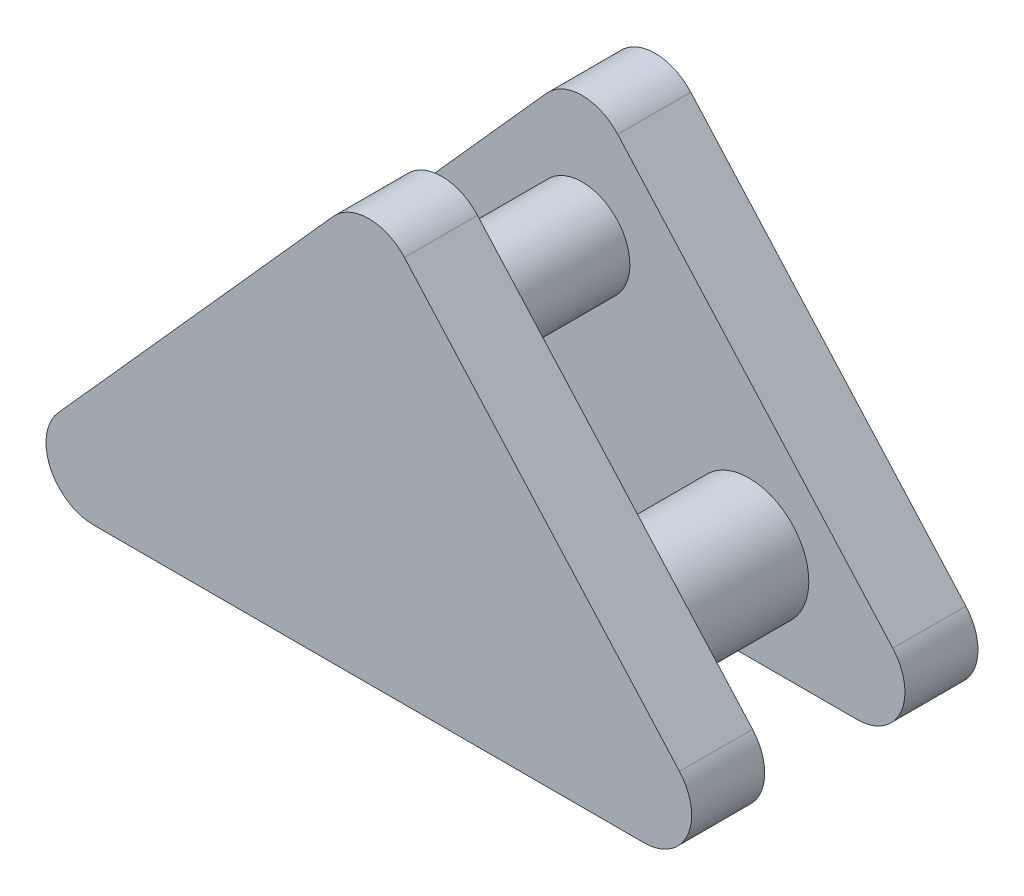
ISO-10303-21;
HEADER;
FILE_DESCRIPTION(('STEP AP214'),'2;1');
FILE_NAME('part.step','',(''),(''),'','','');
FILE_SCHEMA(('AUTOMOTIVE_DESIGN { 1 0 10303 214 1 1 1 1 }'));
ENDSEC;
DATA;
#1=APPLICATION_CONTEXT('core data for automotive mechanical design processes');
#2=APPLICATION_PROTOCOL_DEFINITION('international standard','automotive_design',2000,#1);
#3=PRODUCT_CONTEXT('',#1,'mechanical');
#4=PRODUCT('Part','Part','',(#3));
#5=PRODUCT_RELATED_PRODUCT_CATEGORY('part','',(#4));
#6=PRODUCT_DEFINITION_FORMATION('','',#4);
#7=PRODUCT_DEFINITION_CONTEXT('part definition',#1,'design');
#8=PRODUCT_DEFINITION('design','',#6,#7);
#9=PRODUCT_DEFINITION_SHAPE('','',#8);
#10=(LENGTH_UNIT() NAMED_UNIT(*) SI_UNIT(.MILLI.,.METRE.));
#11=(NAMED_UNIT(*) PLANE_ANGLE_UNIT() SI_UNIT($,.RADIAN.));
#12=(NAMED_UNIT(*) SI_UNIT($,.STERADIAN.) SOLID_ANGLE_UNIT());
#13=UNCERTAINTY_MEASURE_WITH_UNIT(LENGTH_MEASURE(1.E-05),#10,'distance_accuracy_value','');
#14=(GEOMETRIC_REPRESENTATION_CONTEXT(3) GLOBAL_UNCERTAINTY_ASSIGNED_CONTEXT((#13)) GLOBAL_UNIT_ASSIGNED_CONTEXT((#10,
#11,#12)) REPRESENTATION_CONTEXT('',''));
#15=CARTESIAN_POINT('',(0.,0.,0.));
#16=DIRECTION('',(0.,0.,1.));
#17=DIRECTION('',(1.,0.,0.));
#18=AXIS2_PLACEMENT_3D('',#15,#16,#17);
#19=CARTESIAN_POINT('',(0.,5.87463905713637,6.));
#20=DIRECTION('',(0.,0.,-1.));
#21=DIRECTION('',(-1.,0.,0.));
#22=AXIS2_PLACEMENT_3D('',#19,#20,#21);
#23=CYLINDRICAL_SURFACE('',#22,1.);
#24=CARTESIAN_POINT('',(0.,5.87463905713637,4.46937750553797));
#25=DIRECTION('',(0.,0.,1.));
#26=DIRECTION('',(1.,0.,0.));
#27=AXIS2_PLACEMENT_3D('',#24,#25,#26);
#28=CIRCLE('',#27,1.);
#29=CARTESIAN_POINT('',(1.,5.87463905713637,4.46937750553797));
#30=VERTEX_POINT('',#29);
#31=EDGE_CURVE('E163',#30,#30,#28,.F.);
#32=ORIENTED_EDGE('',*,*,#31,.T.);
#33=EDGE_LOOP('',(#32));
#34=FACE_BOUND('',#33,.T.);
#35=CARTESIAN_POINT('',(0.,5.87463905713637,1.53062249446203));
#36=DIRECTION('',(0.,0.,-1.));
#37=DIRECTION('',(0.,1.,0.));
#38=AXIS2_PLACEMENT_3D('',#35,#36,#37);
#39=CIRCLE('',#38,1.);
#40=CARTESIAN_POINT('',(0.,6.87463905713637,1.53062249446203));
#41=VERTEX_POINT('',#40);
#42=EDGE_CURVE('E166',#41,#41,#39,.T.);
#43=ORIENTED_EDGE('',*,*,#42,.F.);
#44=EDGE_LOOP('',(#43));
#45=FACE_BOUND('',#44,.T.);
#46=ADVANCED_FACE('F37',(#34,#45),#23,.T.);
#47=CARTESIAN_POINT('',(0.,8.94427190999916,6.));
#48=DIRECTION('',(0.74535599249993,-0.666666666666667,0.));
#49=DIRECTION('',(0.666666666666667,0.74535599249993,0.));
#50=AXIS2_PLACEMENT_3D('',#47,#48,#49);
#51=PLANE('',#50);
#52=DIRECTION('',(-0.666666666666667,-0.74535599249993,0.));
#53=VECTOR('',#52,1.);
#54=CARTESIAN_POINT('',(0.,8.94427190999916,4.46937750553797));
#55=LINE('',#54,#53);
#56=CARTESIAN_POINT('',(-0.74535599249993,8.11093857666583,4.46937750553797));
#57=VERTEX_POINT('',#56);
#58=CARTESIAN_POINT('',(-6.50928801500014,1.66666666666667,4.46937750553797));
#59=VERTEX_POINT('',#58);
#60=EDGE_CURVE('E154',#57,#59,#55,.T.);
#61=ORIENTED_EDGE('',*,*,#60,.T.);
#62=DIRECTION('',(0.,0.,-1.));
#63=VECTOR('',#62,1.);
#64=CARTESIAN_POINT('',(-6.50928801500014,1.66666666666667,6.));
#65=LINE('',#64,#63);
#66=CARTESIAN_POINT('',(-6.50928801500014,1.66666666666667,6.));
#67=VERTEX_POINT('',#66);
#68=EDGE_CURVE('E132',#59,#67,#65,.F.);
#69=ORIENTED_EDGE('',*,*,#68,.T.);
#70=DIRECTION('',(-0.666666666666667,-0.74535599249993,0.));
#71=VECTOR('',#70,1.);
#72=CARTESIAN_POINT('',(0.,8.94427190999916,6.));
#73=LINE('',#72,#71);
#74=CARTESIAN_POINT('',(-0.74535599249993,8.11093857666583,6.));
#75=VERTEX_POINT('',#74);
#76=EDGE_CURVE('E157',#75,#67,#73,.T.);
#77=ORIENTED_EDGE('',*,*,#76,.F.);
#78=DIRECTION('',(0.,0.,-1.));
#79=VECTOR('',#78,1.);
#80=CARTESIAN_POINT('',(-0.74535599249993,8.11093857666583,6.));
#81=LINE('',#80,#79);
#82=EDGE_CURVE('E137',#75,#57,#81,.T.);
#83=ORIENTED_EDGE('',*,*,#82,.T.);
#84=EDGE_LOOP('',(#61,#69,#77,#83));
#85=FACE_BOUND('',#84,.T.);
#86=ADVANCED_FACE('F226',(#85),#51,.F.);
#87=CARTESIAN_POINT('',(-8.,0.,6.));
#88=DIRECTION('',(0.,1.,0.));
#89=DIRECTION('',(0.,0.,1.));
#90=AXIS2_PLACEMENT_3D('',#87,#88,#89);
#91=PLANE('',#90);
#92=DIRECTION('',(1.,0.,0.));
#93=VECTOR('',#92,1.);
#94=CARTESIAN_POINT('',(-8.,0.,6.));
#95=LINE('',#94,#93);
#96=CARTESIAN_POINT('',(-5.76393202250021,0.,6.));
#97=VERTEX_POINT('',#96);
#98=CARTESIAN_POINT('',(5.76393202250021,0.,6.));
#99=VERTEX_POINT('',#98);
#100=EDGE_CURVE('E147',#97,#99,#95,.T.);
#101=ORIENTED_EDGE('',*,*,#100,.F.);
#102=DIRECTION('',(0.,0.,-1.));
#103=VECTOR('',#102,1.);
#104=CARTESIAN_POINT('',(-5.76393202250021,0.,6.));
#105=LINE('',#104,#103);
#106=CARTESIAN_POINT('',(-5.76393202250021,0.,4.46937750553797));
#107=VERTEX_POINT('',#106);
#108=EDGE_CURVE('E131',#97,#107,#105,.T.);
#109=ORIENTED_EDGE('',*,*,#108,.T.);
#110=DIRECTION('',(1.,0.,0.));
#111=VECTOR('',#110,1.);
#112=CARTESIAN_POINT('',(-8.,0.,4.46937750553797));
#113=LINE('',#112,#111);
#114=CARTESIAN_POINT('',(5.76393202250021,0.,4.46937750553797));
#115=VERTEX_POINT('',#114);
#116=EDGE_CURVE('E144',#107,#115,#113,.T.);
#117=ORIENTED_EDGE('',*,*,#116,.T.);
#118=DIRECTION('',(0.,0.,-1.));
#119=VECTOR('',#118,1.);
#120=CARTESIAN_POINT('',(5.76393202250021,0.,6.));
#121=LINE('',#120,#119);
#122=EDGE_CURVE('E149',#115,#99,#121,.F.);
#123=ORIENTED_EDGE('',*,*,#122,.T.);
#124=EDGE_LOOP('',(#101,#109,#117,#123));
#125=FACE_BOUND('',#124,.T.);
#126=ADVANCED_FACE('F143',(#125),#91,.F.);
#127=CARTESIAN_POINT('',(8.,0.,6.));
#128=DIRECTION('',(-0.74535599249993,-0.666666666666667,0.));
#129=DIRECTION('',(0.666666666666667,-0.74535599249993,0.));
#130=AXIS2_PLACEMENT_3D('',#127,#128,#129);
#131=PLANE('',#130);
#132=DIRECTION('',(-0.666666666666667,0.74535599249993,0.));
#133=VECTOR('',#132,1.);
#134=CARTESIAN_POINT('',(8.,0.,4.46937750553797));
#135=LINE('',#134,#133);
#136=CARTESIAN_POINT('',(6.50928801500014,1.66666666666667,4.46937750553797));
#137=VERTEX_POINT('',#136);
#138=CARTESIAN_POINT('',(0.745355992499931,8.11093857666583,4.46937750553797));
#139=VERTEX_POINT('',#138);
#140=EDGE_CURVE('E153',#137,#139,#135,.T.);
#141=ORIENTED_EDGE('',*,*,#140,.T.);
#142=DIRECTION('',(0.,0.,-1.));
#143=VECTOR('',#142,1.);
#144=CARTESIAN_POINT('',(0.745355992499931,8.11093857666583,6.));
#145=LINE('',#144,#143);
#146=CARTESIAN_POINT('',(0.745355992499931,8.11093857666583,6.));
#147=VERTEX_POINT('',#146);
#148=EDGE_CURVE('E208',#139,#147,#145,.F.);
#149=ORIENTED_EDGE('',*,*,#148,.T.);
#150=DIRECTION('',(-0.666666666666667,0.74535599249993,0.));
#151=VECTOR('',#150,1.);
#152=CARTESIAN_POINT('',(8.,0.,6.));
#153=LINE('',#152,#151);
#154=CARTESIAN_POINT('',(6.50928801500014,1.66666666666667,6.));
#155=VERTEX_POINT('',#154);
#156=EDGE_CURVE('E167',#155,#147,#153,.T.);
#157=ORIENTED_EDGE('',*,*,#156,.F.);
#158=DIRECTION('',(0.,0.,-1.));
#159=VECTOR('',#158,1.);
#160=CARTESIAN_POINT('',(6.50928801500014,1.66666666666667,6.));
#161=LINE('',#160,#159);
#162=EDGE_CURVE('E205',#155,#137,#161,.T.);
#163=ORIENTED_EDGE('',*,*,#162,.T.);
#164=EDGE_LOOP('',(#141,#149,#157,#163));
#165=FACE_BOUND('',#164,.T.);
#166=ADVANCED_FACE('F213',(#165),#131,.F.);
#167=CARTESIAN_POINT('',(0.,0.,6.));
#168=DIRECTION('',(0.,0.,-1.));
#169=DIRECTION('',(-1.,0.,0.));
#170=AXIS2_PLACEMENT_3D('',#167,#168,#169);
#171=PLANE('',#170);
#172=ORIENTED_EDGE('',*,*,#76,.T.);
#173=CARTESIAN_POINT('',(-5.76393202250021,1.,6.));
#174=DIRECTION('',(0.,0.,-1.));
#175=DIRECTION('',(-1.,0.,0.));
#176=AXIS2_PLACEMENT_3D('',#173,#174,#175);
#177=CIRCLE('',#176,1.);
#178=EDGE_CURVE('E182',#67,#97,#177,.F.);
#179=ORIENTED_EDGE('',*,*,#178,.T.);
#180=ORIENTED_EDGE('',*,*,#100,.T.);
#181=CARTESIAN_POINT('',(5.76393202250021,1.,6.));
#182=DIRECTION('',(0.,0.,-1.));
#183=DIRECTION('',(-1.,0.,0.));
#184=AXIS2_PLACEMENT_3D('',#181,#182,#183);
#185=CIRCLE('',#184,1.);
#186=EDGE_CURVE('E178',#99,#155,#185,.F.);
#187=ORIENTED_EDGE('',*,*,#186,.T.);
#188=ORIENTED_EDGE('',*,*,#156,.T.);
#189=CARTESIAN_POINT('',(0.,7.44427190999916,6.));
#190=DIRECTION('',(0.,0.,-1.));
#191=DIRECTION('',(-1.,0.,0.));
#192=AXIS2_PLACEMENT_3D('',#189,#190,#191);
#193=CIRCLE('',#192,1.);
#194=EDGE_CURVE('E180',#147,#75,#193,.F.);
#195=ORIENTED_EDGE('',*,*,#194,.T.);
#196=EDGE_LOOP('',(#172,#179,#180,#187,#188,#195));
#197=FACE_BOUND('',#196,.T.);
#198=ADVANCED_FACE('F219',(#197),#171,.F.);
#199=CARTESIAN_POINT('',(-8.,0.,4.46937750553797));
#200=DIRECTION('',(0.,0.,1.));
#201=DIRECTION('',(1.,0.,0.));
#202=AXIS2_PLACEMENT_3D('',#199,#200,#201);
#203=PLANE('',#202);
#204=CARTESIAN_POINT('',(3.5,2.,4.46937750553797));
#205=DIRECTION('',(0.,0.,1.));
#206=DIRECTION('',(1.,0.,0.));
#207=AXIS2_PLACEMENT_3D('',#204,#205,#206);
#208=CIRCLE('',#207,1.25);
#209=CARTESIAN_POINT('',(4.75,2.,4.46937750553797));
#210=VERTEX_POINT('',#209);
#211=EDGE_CURVE('E171',#210,#210,#208,.F.);
#212=ORIENTED_EDGE('',*,*,#211,.F.);
#213=EDGE_LOOP('',(#212));
#214=FACE_BOUND('',#213,.T.);
#215=CARTESIAN_POINT('',(-3.5,2.,4.46937750553797));
#216=DIRECTION('',(0.,0.,1.));
#217=DIRECTION('',(1.,0.,0.));
#218=AXIS2_PLACEMENT_3D('',#215,#216,#217);
#219=CIRCLE('',#218,1.25);
#220=CARTESIAN_POINT('',(-2.25,2.,4.46937750553797));
#221=VERTEX_POINT('',#220);
#222=EDGE_CURVE('E243',#221,#221,#219,.F.);
#223=ORIENTED_EDGE('',*,*,#222,.F.);
#224=EDGE_LOOP('',(#223));
#225=FACE_BOUND('',#224,.T.);
#226=ORIENTED_EDGE('',*,*,#31,.F.);
#227=EDGE_LOOP('',(#226));
#228=FACE_BOUND('',#227,.T.);
#229=ORIENTED_EDGE('',*,*,#116,.F.);
#230=CARTESIAN_POINT('',(-5.76393202250021,1.,4.46937750553797));
#231=DIRECTION('',(0.,0.,1.));
#232=DIRECTION('',(1.,0.,0.));
#233=AXIS2_PLACEMENT_3D('',#230,#231,#232);
#234=CIRCLE('',#233,1.);
#235=EDGE_CURVE('E127',#107,#59,#234,.F.);
#236=ORIENTED_EDGE('',*,*,#235,.T.);
#237=ORIENTED_EDGE('',*,*,#60,.F.);
#238=CARTESIAN_POINT('',(0.,7.44427190999916,4.46937750553797));
#239=DIRECTION('',(0.,0.,1.));
#240=DIRECTION('',(1.,0.,0.));
#241=AXIS2_PLACEMENT_3D('',#238,#239,#240);
#242=CIRCLE('',#241,1.);
#243=EDGE_CURVE('E138',#57,#139,#242,.F.);
#244=ORIENTED_EDGE('',*,*,#243,.T.);
#245=ORIENTED_EDGE('',*,*,#140,.F.);
#246=CARTESIAN_POINT('',(5.76393202250021,1.,4.46937750553797));
#247=DIRECTION('',(0.,0.,1.));
#248=DIRECTION('',(1.,0.,0.));
#249=AXIS2_PLACEMENT_3D('',#246,#247,#248);
#250=CIRCLE('',#249,1.);
#251=EDGE_CURVE('E148',#137,#115,#250,.F.);
#252=ORIENTED_EDGE('',*,*,#251,.T.);
#253=EDGE_LOOP('',(#229,#236,#237,#244,#245,#252));
#254=FACE_BOUND('',#253,.T.);
#255=ADVANCED_FACE('F151',(#214,#225,#228,#254),#203,.F.);
#256=CARTESIAN_POINT('',(8.,0.,6.));
#257=DIRECTION('',(-0.74535599249993,-0.666666666666667,0.));
#258=DIRECTION('',(0.666666666666667,-0.74535599249993,0.));
#259=AXIS2_PLACEMENT_3D('',#256,#257,#258);
#260=PLANE('',#259);
#261=DIRECTION('',(0.666666666666667,-0.74535599249993,0.));
#262=VECTOR('',#261,1.);
#263=CARTESIAN_POINT('',(8.,0.,1.53062249446203));
#264=LINE('',#263,#262);
#265=CARTESIAN_POINT('',(0.745355992499931,8.11093857666583,1.53062249446203));
#266=VERTEX_POINT('',#265);
#267=CARTESIAN_POINT('',(6.50928801500014,1.66666666666667,1.53062249446203));
#268=VERTEX_POINT('',#267);
#269=EDGE_CURVE('E159',#266,#268,#264,.T.);
#270=ORIENTED_EDGE('',*,*,#269,.T.);
#271=DIRECTION('',(0.,0.,-1.));
#272=VECTOR('',#271,1.);
#273=CARTESIAN_POINT('',(6.50928801500014,1.66666666666667,6.));
#274=LINE('',#273,#272);
#275=CARTESIAN_POINT('',(6.50928801500014,1.66666666666667,0.));
#276=VERTEX_POINT('',#275);
#277=EDGE_CURVE('E11',#268,#276,#274,.T.);
#278=ORIENTED_EDGE('',*,*,#277,.T.);
#279=DIRECTION('',(-0.666666666666667,0.74535599249993,0.));
#280=VECTOR('',#279,1.);
#281=CARTESIAN_POINT('',(8.,0.,0.));
#282=LINE('',#281,#280);
#283=CARTESIAN_POINT('',(0.745355992499931,8.11093857666583,0.));
#284=VERTEX_POINT('',#283);
#285=EDGE_CURVE('E230',#276,#284,#282,.T.);
#286=ORIENTED_EDGE('',*,*,#285,.T.);
#287=DIRECTION('',(0.,0.,-1.));
#288=VECTOR('',#287,1.);
#289=CARTESIAN_POINT('',(0.745355992499931,8.11093857666583,6.));
#290=LINE('',#289,#288);
#291=EDGE_CURVE('E45',#284,#266,#290,.F.);
#292=ORIENTED_EDGE('',*,*,#291,.T.);
#293=EDGE_LOOP('',(#270,#278,#286,#292));
#294=FACE_BOUND('',#293,.T.);
#295=ADVANCED_FACE('F286',(#294),#260,.F.);
#296=CARTESIAN_POINT('',(-8.,0.,6.));
#297=DIRECTION('',(0.,1.,0.));
#298=DIRECTION('',(0.,0.,1.));
#299=AXIS2_PLACEMENT_3D('',#296,#297,#298);
#300=PLANE('',#299);
#301=DIRECTION('',(1.,0.,0.));
#302=VECTOR('',#301,1.);
#303=CARTESIAN_POINT('',(-8.,0.,1.53062249446203));
#304=LINE('',#303,#302);
#305=CARTESIAN_POINT('',(-5.76393202250021,0.,1.53062249446203));
#306=VERTEX_POINT('',#305);
#307=CARTESIAN_POINT('',(5.76393202250021,0.,1.53062249446203));
#308=VERTEX_POINT('',#307);
#309=EDGE_CURVE('E241',#306,#308,#304,.T.);
#310=ORIENTED_EDGE('',*,*,#309,.F.);
#311=DIRECTION('',(0.,0.,-1.));
#312=VECTOR('',#311,1.);
#313=CARTESIAN_POINT('',(-5.76393202250021,0.,6.));
#314=LINE('',#313,#312);
#315=CARTESIAN_POINT('',(-5.76393202250021,0.,0.));
#316=VERTEX_POINT('',#315);
#317=EDGE_CURVE('E186',#306,#316,#314,.T.);
#318=ORIENTED_EDGE('',*,*,#317,.T.);
#319=DIRECTION('',(1.,0.,0.));
#320=VECTOR('',#319,1.);
#321=CARTESIAN_POINT('',(-8.,0.,0.));
#322=LINE('',#321,#320);
#323=CARTESIAN_POINT('',(5.76393202250021,0.,0.));
#324=VERTEX_POINT('',#323);
#325=EDGE_CURVE('E232',#316,#324,#322,.T.);
#326=ORIENTED_EDGE('',*,*,#325,.T.);
#327=DIRECTION('',(0.,0.,-1.));
#328=VECTOR('',#327,1.);
#329=CARTESIAN_POINT('',(5.76393202250021,0.,6.));
#330=LINE('',#329,#328);
#331=EDGE_CURVE('E184',#324,#308,#330,.F.);
#332=ORIENTED_EDGE('',*,*,#331,.T.);
#333=EDGE_LOOP('',(#310,#318,#326,#332));
#334=FACE_BOUND('',#333,.T.);
#335=ADVANCED_FACE('F278',(#334),#300,.F.);
#336=CARTESIAN_POINT('',(0.,8.94427190999916,6.));
#337=DIRECTION('',(0.74535599249993,-0.666666666666667,0.));
#338=DIRECTION('',(0.666666666666667,0.74535599249993,0.));
#339=AXIS2_PLACEMENT_3D('',#336,#337,#338);
#340=PLANE('',#339);
#341=DIRECTION('',(-0.666666666666667,-0.74535599249993,0.));
#342=VECTOR('',#341,1.);
#343=CARTESIAN_POINT('',(0.,8.94427190999916,0.));
#344=LINE('',#343,#342);
#345=CARTESIAN_POINT('',(-0.74535599249993,8.11093857666583,0.));
#346=VERTEX_POINT('',#345);
#347=CARTESIAN_POINT('',(-6.50928801500014,1.66666666666667,0.));
#348=VERTEX_POINT('',#347);
#349=EDGE_CURVE('E235',#346,#348,#344,.T.);
#350=ORIENTED_EDGE('',*,*,#349,.T.);
#351=DIRECTION('',(0.,0.,-1.));
#352=VECTOR('',#351,1.);
#353=CARTESIAN_POINT('',(-6.50928801500014,1.66666666666667,6.));
#354=LINE('',#353,#352);
#355=CARTESIAN_POINT('',(-6.50928801500014,1.66666666666667,1.53062249446203));
#356=VERTEX_POINT('',#355);
#357=EDGE_CURVE('E198',#348,#356,#354,.F.);
#358=ORIENTED_EDGE('',*,*,#357,.T.);
#359=DIRECTION('',(0.666666666666667,0.74535599249993,0.));
#360=VECTOR('',#359,1.);
#361=CARTESIAN_POINT('',(0.,8.94427190999916,1.53062249446203));
#362=LINE('',#361,#360);
#363=CARTESIAN_POINT('',(-0.74535599249993,8.11093857666583,1.53062249446203));
#364=VERTEX_POINT('',#363);
#365=EDGE_CURVE('E238',#356,#364,#362,.T.);
#366=ORIENTED_EDGE('',*,*,#365,.T.);
#367=DIRECTION('',(0.,0.,-1.));
#368=VECTOR('',#367,1.);
#369=CARTESIAN_POINT('',(-0.74535599249993,8.11093857666583,6.));
#370=LINE('',#369,#368);
#371=EDGE_CURVE('E195',#364,#346,#370,.T.);
#372=ORIENTED_EDGE('',*,*,#371,.T.);
#373=EDGE_LOOP('',(#350,#358,#366,#372));
#374=FACE_BOUND('',#373,.T.);
#375=ADVANCED_FACE('F261',(#374),#340,.F.);
#376=CARTESIAN_POINT('',(-8.,8.94427190999916,1.53062249446203));
#377=DIRECTION('',(0.,0.,-1.));
#378=DIRECTION('',(0.,1.,0.));
#379=AXIS2_PLACEMENT_3D('',#376,#377,#378);
#380=PLANE('',#379);
#381=CARTESIAN_POINT('',(3.5,2.,1.53062249446203));
#382=DIRECTION('',(0.,0.,-1.));
#383=DIRECTION('',(0.,1.,0.));
#384=AXIS2_PLACEMENT_3D('',#381,#382,#383);
#385=CIRCLE('',#384,1.25);
#386=CARTESIAN_POINT('',(3.5,3.25,1.53062249446203));
#387=VERTEX_POINT('',#386);
#388=EDGE_CURVE('E246',#387,#387,#385,.F.);
#389=ORIENTED_EDGE('',*,*,#388,.F.);
#390=EDGE_LOOP('',(#389));
#391=FACE_BOUND('',#390,.T.);
#392=CARTESIAN_POINT('',(-3.5,2.,1.53062249446203));
#393=DIRECTION('',(0.,0.,-1.));
#394=DIRECTION('',(0.,1.,0.));
#395=AXIS2_PLACEMENT_3D('',#392,#393,#394);
#396=CIRCLE('',#395,1.25);
#397=CARTESIAN_POINT('',(-3.5,3.25,1.53062249446203));
#398=VERTEX_POINT('',#397);
#399=EDGE_CURVE('E170',#398,#398,#396,.F.);
#400=ORIENTED_EDGE('',*,*,#399,.F.);
#401=EDGE_LOOP('',(#400));
#402=FACE_BOUND('',#401,.T.);
#403=ORIENTED_EDGE('',*,*,#42,.T.);
#404=EDGE_LOOP('',(#403));
#405=FACE_BOUND('',#404,.T.);
#406=ORIENTED_EDGE('',*,*,#365,.F.);
#407=CARTESIAN_POINT('',(-5.76393202250021,1.,1.53062249446203));
#408=DIRECTION('',(0.,0.,-1.));
#409=DIRECTION('',(0.,1.,0.));
#410=AXIS2_PLACEMENT_3D('',#407,#408,#409);
#411=CIRCLE('',#410,1.);
#412=EDGE_CURVE('E203',#356,#306,#411,.F.);
#413=ORIENTED_EDGE('',*,*,#412,.T.);
#414=ORIENTED_EDGE('',*,*,#309,.T.);
#415=CARTESIAN_POINT('',(5.76393202250021,1.,1.53062249446203));
#416=DIRECTION('',(0.,0.,-1.));
#417=DIRECTION('',(0.,1.,0.));
#418=AXIS2_PLACEMENT_3D('',#415,#416,#417);
#419=CIRCLE('',#418,1.);
#420=EDGE_CURVE('E52',#308,#268,#419,.F.);
#421=ORIENTED_EDGE('',*,*,#420,.T.);
#422=ORIENTED_EDGE('',*,*,#269,.F.);
#423=CARTESIAN_POINT('',(0.,7.44427190999916,1.53062249446203));
#424=DIRECTION('',(0.,0.,-1.));
#425=DIRECTION('',(0.,1.,0.));
#426=AXIS2_PLACEMENT_3D('',#423,#424,#425);
#427=CIRCLE('',#426,1.);
#428=EDGE_CURVE('E200',#266,#364,#427,.F.);
#429=ORIENTED_EDGE('',*,*,#428,.T.);
#430=EDGE_LOOP('',(#406,#413,#414,#421,#422,#429));
#431=FACE_BOUND('',#430,.T.);
#432=ADVANCED_FACE('F257',(#391,#402,#405,#431),#380,.F.);
#433=CARTESIAN_POINT('',(0.,5.87463905713637,0.));
#434=DIRECTION('',(0.,0.,1.));
#435=DIRECTION('',(1.,0.,0.));
#436=AXIS2_PLACEMENT_3D('',#433,#434,#435);
#437=PLANE('',#436);
#438=ORIENTED_EDGE('',*,*,#325,.F.);
#439=CARTESIAN_POINT('',(-5.76393202250021,1.,0.));
#440=DIRECTION('',(0.,0.,1.));
#441=DIRECTION('',(1.,0.,0.));
#442=AXIS2_PLACEMENT_3D('',#439,#440,#441);
#443=CIRCLE('',#442,1.);
#444=EDGE_CURVE('E193',#316,#348,#443,.F.);
#445=ORIENTED_EDGE('',*,*,#444,.T.);
#446=ORIENTED_EDGE('',*,*,#349,.F.);
#447=CARTESIAN_POINT('',(0.,7.44427190999916,0.));
#448=DIRECTION('',(0.,0.,1.));
#449=DIRECTION('',(1.,0.,0.));
#450=AXIS2_PLACEMENT_3D('',#447,#448,#449);
#451=CIRCLE('',#450,1.);
#452=EDGE_CURVE('E189',#346,#284,#451,.F.);
#453=ORIENTED_EDGE('',*,*,#452,.T.);
#454=ORIENTED_EDGE('',*,*,#285,.F.);
#455=CARTESIAN_POINT('',(5.76393202250021,1.,0.));
#456=DIRECTION('',(0.,0.,1.));
#457=DIRECTION('',(1.,0.,0.));
#458=AXIS2_PLACEMENT_3D('',#455,#456,#457);
#459=CIRCLE('',#458,1.);
#460=EDGE_CURVE('E191',#276,#324,#459,.F.);
#461=ORIENTED_EDGE('',*,*,#460,.T.);
#462=EDGE_LOOP('',(#438,#445,#446,#453,#454,#461));
#463=FACE_BOUND('',#462,.T.);
#464=ADVANCED_FACE('F260',(#463),#437,.F.);
#465=CARTESIAN_POINT('',(-3.5,2.,6.));
#466=DIRECTION('',(0.,0.,-1.));
#467=DIRECTION('',(-1.,0.,0.));
#468=AXIS2_PLACEMENT_3D('',#465,#466,#467);
#469=CYLINDRICAL_SURFACE('',#468,1.25);
#470=ORIENTED_EDGE('',*,*,#399,.T.);
#471=EDGE_LOOP('',(#470));
#472=FACE_BOUND('',#471,.T.);
#473=ORIENTED_EDGE('',*,*,#222,.T.);
#474=EDGE_LOOP('',(#473));
#475=FACE_BOUND('',#474,.T.);
#476=ADVANCED_FACE('F367',(#472,#475),#469,.T.);
#477=CARTESIAN_POINT('',(3.5,2.,6.));
#478=DIRECTION('',(0.,0.,-1.));
#479=DIRECTION('',(-1.,0.,0.));
#480=AXIS2_PLACEMENT_3D('',#477,#478,#479);
#481=CYLINDRICAL_SURFACE('',#480,1.25);
#482=ORIENTED_EDGE('',*,*,#388,.T.);
#483=EDGE_LOOP('',(#482));
#484=FACE_BOUND('',#483,.T.);
#485=ORIENTED_EDGE('',*,*,#211,.T.);
#486=EDGE_LOOP('',(#485));
#487=FACE_BOUND('',#486,.T.);
#488=ADVANCED_FACE('F254',(#484,#487),#481,.T.);
#489=CARTESIAN_POINT('',(-5.76393202250021,1.,6.));
#490=DIRECTION('',(0.,0.,-1.));
#491=DIRECTION('',(-1.,0.,0.));
#492=AXIS2_PLACEMENT_3D('',#489,#490,#491);
#493=CYLINDRICAL_SURFACE('',#492,1.);
#494=ORIENTED_EDGE('',*,*,#178,.F.);
#495=ORIENTED_EDGE('',*,*,#68,.F.);
#496=ORIENTED_EDGE('',*,*,#235,.F.);
#497=ORIENTED_EDGE('',*,*,#108,.F.);
#498=EDGE_LOOP('',(#494,#495,#496,#497));
#499=FACE_BOUND('',#498,.T.);
#500=ADVANCED_FACE('F130',(#499),#493,.T.);
#501=CARTESIAN_POINT('',(-5.76393202250021,1.,6.));
#502=DIRECTION('',(0.,0.,-1.));
#503=DIRECTION('',(-1.,0.,0.));
#504=AXIS2_PLACEMENT_3D('',#501,#502,#503);
#505=CYLINDRICAL_SURFACE('',#504,1.);
#506=ORIENTED_EDGE('',*,*,#412,.F.);
#507=ORIENTED_EDGE('',*,*,#357,.F.);
#508=ORIENTED_EDGE('',*,*,#444,.F.);
#509=ORIENTED_EDGE('',*,*,#317,.F.);
#510=EDGE_LOOP('',(#506,#507,#508,#509));
#511=FACE_BOUND('',#510,.T.);
#512=ADVANCED_FACE('F275',(#511),#505,.T.);
#513=CARTESIAN_POINT('',(0.,7.44427190999916,6.));
#514=DIRECTION('',(0.,0.,-1.));
#515=DIRECTION('',(-1.,0.,0.));
#516=AXIS2_PLACEMENT_3D('',#513,#514,#515);
#517=CYLINDRICAL_SURFACE('',#516,1.);
#518=ORIENTED_EDGE('',*,*,#194,.F.);
#519=ORIENTED_EDGE('',*,*,#148,.F.);
#520=ORIENTED_EDGE('',*,*,#243,.F.);
#521=ORIENTED_EDGE('',*,*,#82,.F.);
#522=EDGE_LOOP('',(#518,#519,#520,#521));
#523=FACE_BOUND('',#522,.T.);
#524=ADVANCED_FACE('F224',(#523),#517,.T.);
#525=CARTESIAN_POINT('',(5.76393202250021,1.,6.));
#526=DIRECTION('',(0.,0.,-1.));
#527=DIRECTION('',(-1.,0.,0.));
#528=AXIS2_PLACEMENT_3D('',#525,#526,#527);
#529=CYLINDRICAL_SURFACE('',#528,1.);
#530=ORIENTED_EDGE('',*,*,#186,.F.);
#531=ORIENTED_EDGE('',*,*,#122,.F.);
#532=ORIENTED_EDGE('',*,*,#251,.F.);
#533=ORIENTED_EDGE('',*,*,#162,.F.);
#534=EDGE_LOOP('',(#530,#531,#532,#533));
#535=FACE_BOUND('',#534,.T.);
#536=ADVANCED_FACE('F319',(#535),#529,.T.);
#537=CARTESIAN_POINT('',(5.76393202250021,1.,6.));
#538=DIRECTION('',(0.,0.,-1.));
#539=DIRECTION('',(-1.,0.,0.));
#540=AXIS2_PLACEMENT_3D('',#537,#538,#539);
#541=CYLINDRICAL_SURFACE('',#540,1.);
#542=ORIENTED_EDGE('',*,*,#420,.F.);
#543=ORIENTED_EDGE('',*,*,#331,.F.);
#544=ORIENTED_EDGE('',*,*,#460,.F.);
#545=ORIENTED_EDGE('',*,*,#277,.F.);
#546=EDGE_LOOP('',(#542,#543,#544,#545));
#547=FACE_BOUND('',#546,.T.);
#548=ADVANCED_FACE('F285',(#547),#541,.T.);
#549=CARTESIAN_POINT('',(0.,7.44427190999916,6.));
#550=DIRECTION('',(0.,0.,-1.));
#551=DIRECTION('',(-1.,0.,0.));
#552=AXIS2_PLACEMENT_3D('',#549,#550,#551);
#553=CYLINDRICAL_SURFACE('',#552,1.);
#554=ORIENTED_EDGE('',*,*,#428,.F.);
#555=ORIENTED_EDGE('',*,*,#291,.F.);
#556=ORIENTED_EDGE('',*,*,#452,.F.);
#557=ORIENTED_EDGE('',*,*,#371,.F.);
#558=EDGE_LOOP('',(#554,#555,#556,#557));
#559=FACE_BOUND('',#558,.T.);
#560=ADVANCED_FACE('F39',(#559),#553,.T.);
#561=CLOSED_SHELL('',(#46,#86,#126,#166,#198,#255,#295,#335,#375,#432,#464,#476,#488,#500,#512,
#524,#536,#548,#560));
#562=MANIFOLD_SOLID_BREP('B2',#561);
#563=ADVANCED_BREP_SHAPE_REPRESENTATION('',(#18,#562),#14);
#564=SHAPE_DEFINITION_REPRESENTATION(#9,#563);
ENDSEC;
END-ISO-10303-21;
